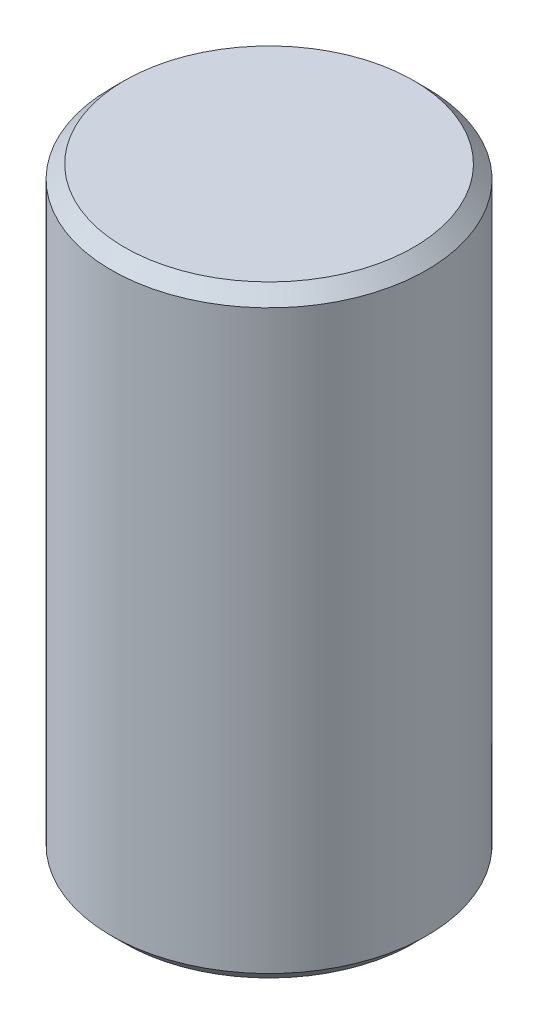
ISO-10303-21;
HEADER;
FILE_DESCRIPTION(('STEP AP214'),'2;1');
FILE_NAME('part.step','',(''),(''),'','','');
FILE_SCHEMA(('AUTOMOTIVE_DESIGN { 1 0 10303 214 1 1 1 1 }'));
ENDSEC;
DATA;
#1=APPLICATION_CONTEXT('core data for automotive mechanical design processes');
#2=APPLICATION_PROTOCOL_DEFINITION('international standard','automotive_design',2000,#1);
#3=PRODUCT_CONTEXT('',#1,'mechanical');
#4=PRODUCT('Part','Part','',(#3));
#5=PRODUCT_RELATED_PRODUCT_CATEGORY('part','',(#4));
#6=PRODUCT_DEFINITION_FORMATION('','',#4);
#7=PRODUCT_DEFINITION_CONTEXT('part definition',#1,'design');
#8=PRODUCT_DEFINITION('design','',#6,#7);
#9=PRODUCT_DEFINITION_SHAPE('','',#8);
#10=(LENGTH_UNIT() NAMED_UNIT(*) SI_UNIT(.MILLI.,.METRE.));
#11=(NAMED_UNIT(*) PLANE_ANGLE_UNIT() SI_UNIT($,.RADIAN.));
#12=(NAMED_UNIT(*) SI_UNIT($,.STERADIAN.) SOLID_ANGLE_UNIT());
#13=UNCERTAINTY_MEASURE_WITH_UNIT(LENGTH_MEASURE(1.E-05),#10,'distance_accuracy_value','');
#14=(GEOMETRIC_REPRESENTATION_CONTEXT(3) GLOBAL_UNCERTAINTY_ASSIGNED_CONTEXT((#13)) GLOBAL_UNIT_ASSIGNED_CONTEXT((#10,
#11,#12)) REPRESENTATION_CONTEXT('',''));
#15=CARTESIAN_POINT('',(0.,0.,0.));
#16=DIRECTION('',(0.,0.,1.));
#17=DIRECTION('',(1.,0.,0.));
#18=AXIS2_PLACEMENT_3D('',#15,#16,#17);
#19=CARTESIAN_POINT('',(-11.0308657865101,5.54599983,-11.0308657865101));
#20=DIRECTION('',(0.,-1.,0.));
#21=DIRECTION('',(1.,0.,0.));
#22=AXIS2_PLACEMENT_3D('',#19,#20,#21);
#23=CONICAL_SURFACE('',#22,2.75,0.785398163397446);
#24=CARTESIAN_POINT('',(-11.0308657865101,5.54599983,-11.0308657865101));
#25=DIRECTION('',(0.,1.,0.));
#26=DIRECTION('',(-1.,0.,0.));
#27=AXIS2_PLACEMENT_3D('',#24,#25,#26);
#28=CIRCLE('',#27,2.75);
#29=CARTESIAN_POINT('',(-13.7808657865101,5.54599983,-11.0308657865101));
#30=VERTEX_POINT('',#29);
#31=EDGE_CURVE('E31',#30,#30,#28,.T.);
#32=ORIENTED_EDGE('',*,*,#31,.F.);
#33=EDGE_LOOP('',(#32));
#34=FACE_BOUND('',#33,.T.);
#35=CARTESIAN_POINT('',(-11.0308657865101,5.29599983,-11.0308657865101));
#36=DIRECTION('',(0.,-1.,0.));
#37=DIRECTION('',(-1.,0.,0.));
#38=AXIS2_PLACEMENT_3D('',#35,#36,#37);
#39=CIRCLE('',#38,3.);
#40=CARTESIAN_POINT('',(-14.0308657865101,5.29599983,-11.0308657865101));
#41=VERTEX_POINT('',#40);
#42=EDGE_CURVE('E10',#41,#41,#39,.T.);
#43=ORIENTED_EDGE('',*,*,#42,.F.);
#44=EDGE_LOOP('',(#43));
#45=FACE_BOUND('',#44,.T.);
#46=ADVANCED_FACE('F15',(#34,#45),#23,.T.);
#47=CARTESIAN_POINT('',(-11.0308657865101,-5.673000092,-11.0308657865101));
#48=DIRECTION('',(0.,1.,0.));
#49=DIRECTION('',(-1.,0.,0.));
#50=AXIS2_PLACEMENT_3D('',#47,#48,#49);
#51=CONICAL_SURFACE('',#50,3.,0.785398163397446);
#52=CARTESIAN_POINT('',(-11.0308657865101,-5.923000092,-11.0308657865101));
#53=DIRECTION('',(0.,-1.,0.));
#54=DIRECTION('',(-1.,0.,0.));
#55=AXIS2_PLACEMENT_3D('',#52,#53,#54);
#56=CIRCLE('',#55,2.75);
#57=CARTESIAN_POINT('',(-13.7808657865101,-5.923000092,-11.0308657865101));
#58=VERTEX_POINT('',#57);
#59=EDGE_CURVE('E39',#58,#58,#56,.T.);
#60=ORIENTED_EDGE('',*,*,#59,.F.);
#61=EDGE_LOOP('',(#60));
#62=FACE_BOUND('',#61,.T.);
#63=CARTESIAN_POINT('',(-11.0308657865101,-5.673000092,-11.0308657865101));
#64=DIRECTION('',(0.,1.,0.));
#65=DIRECTION('',(-1.,0.,0.));
#66=AXIS2_PLACEMENT_3D('',#63,#64,#65);
#67=CIRCLE('',#66,3.);
#68=CARTESIAN_POINT('',(-14.0308657865101,-5.673000092,-11.0308657865101));
#69=VERTEX_POINT('',#68);
#70=EDGE_CURVE('E22',#69,#69,#67,.T.);
#71=ORIENTED_EDGE('',*,*,#70,.F.);
#72=EDGE_LOOP('',(#71));
#73=FACE_BOUND('',#72,.T.);
#74=ADVANCED_FACE('F49',(#62,#73),#51,.T.);
#75=CARTESIAN_POINT('',(-11.0308657865101,5.54599983,-11.0308657865101));
#76=DIRECTION('',(0.,-1.,0.));
#77=DIRECTION('',(1.,0.,0.));
#78=AXIS2_PLACEMENT_3D('',#75,#76,#77);
#79=CYLINDRICAL_SURFACE('',#78,3.);
#80=ORIENTED_EDGE('',*,*,#42,.T.);
#81=EDGE_LOOP('',(#80));
#82=FACE_BOUND('',#81,.T.);
#83=ORIENTED_EDGE('',*,*,#70,.T.);
#84=EDGE_LOOP('',(#83));
#85=FACE_BOUND('',#84,.T.);
#86=ADVANCED_FACE('F52',(#82,#85),#79,.T.);
#87=CARTESIAN_POINT('',(-11.0308657865101,5.54599983,-11.0308657865101));
#88=DIRECTION('',(0.,1.,0.));
#89=DIRECTION('',(1.,0.,0.));
#90=AXIS2_PLACEMENT_3D('',#87,#88,#89);
#91=PLANE('',#90);
#92=ORIENTED_EDGE('',*,*,#31,.T.);
#93=EDGE_LOOP('',(#92));
#94=FACE_BOUND('',#93,.T.);
#95=ADVANCED_FACE('F58',(#94),#91,.T.);
#96=CARTESIAN_POINT('',(-11.0308657865101,-5.923000092,-11.0308657865101));
#97=DIRECTION('',(0.,1.,0.));
#98=DIRECTION('',(1.,0.,0.));
#99=AXIS2_PLACEMENT_3D('',#96,#97,#98);
#100=PLANE('',#99);
#101=ORIENTED_EDGE('',*,*,#59,.T.);
#102=EDGE_LOOP('',(#101));
#103=FACE_BOUND('',#102,.T.);
#104=ADVANCED_FACE('F47',(#103),#100,.F.);
#105=CLOSED_SHELL('',(#46,#74,#86,#95,#104));
#106=MANIFOLD_SOLID_BREP('B1',#105);
#107=ADVANCED_BREP_SHAPE_REPRESENTATION('',(#18,#106),#14);
#108=SHAPE_DEFINITION_REPRESENTATION(#9,#107);
ENDSEC;
END-ISO-10303-21;
